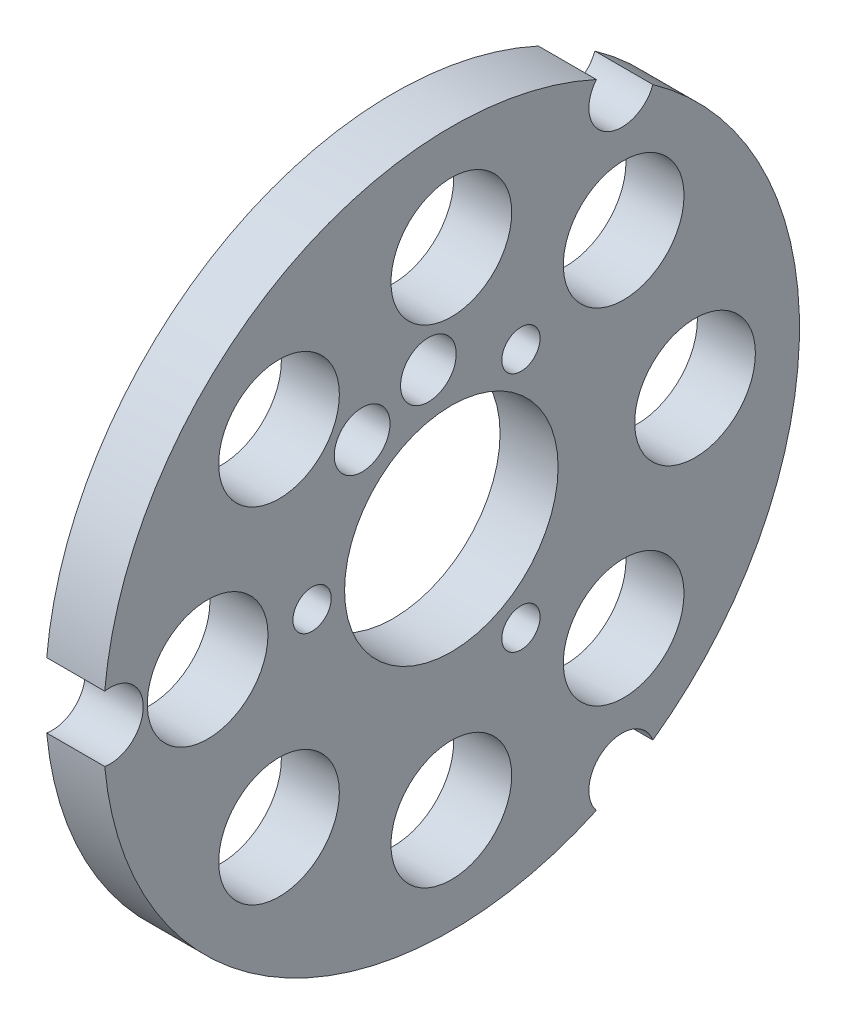
ISO-10303-21;
HEADER;
FILE_DESCRIPTION(('STEP AP214'),'2;1');
FILE_NAME('part.step','',(''),(''),'','','');
FILE_SCHEMA(('AUTOMOTIVE_DESIGN { 1 0 10303 214 1 1 1 1 }'));
ENDSEC;
DATA;
#1=APPLICATION_CONTEXT('core data for automotive mechanical design processes');
#2=APPLICATION_PROTOCOL_DEFINITION('international standard','automotive_design',2000,#1);
#3=PRODUCT_CONTEXT('',#1,'mechanical');
#4=PRODUCT('Part','Part','',(#3));
#5=PRODUCT_RELATED_PRODUCT_CATEGORY('part','',(#4));
#6=PRODUCT_DEFINITION_FORMATION('','',#4);
#7=PRODUCT_DEFINITION_CONTEXT('part definition',#1,'design');
#8=PRODUCT_DEFINITION('design','',#6,#7);
#9=PRODUCT_DEFINITION_SHAPE('','',#8);
#10=(LENGTH_UNIT() NAMED_UNIT(*) SI_UNIT(.MILLI.,.METRE.));
#11=(NAMED_UNIT(*) PLANE_ANGLE_UNIT() SI_UNIT($,.RADIAN.));
#12=(NAMED_UNIT(*) SI_UNIT($,.STERADIAN.) SOLID_ANGLE_UNIT());
#13=UNCERTAINTY_MEASURE_WITH_UNIT(LENGTH_MEASURE(1.E-05),#10,'distance_accuracy_value','');
#14=(GEOMETRIC_REPRESENTATION_CONTEXT(3) GLOBAL_UNCERTAINTY_ASSIGNED_CONTEXT((#13)) GLOBAL_UNIT_ASSIGNED_CONTEXT((#10,
#11,#12)) REPRESENTATION_CONTEXT('',''));
#15=CARTESIAN_POINT('',(0.,0.,0.));
#16=DIRECTION('',(0.,0.,1.));
#17=DIRECTION('',(1.,0.,0.));
#18=AXIS2_PLACEMENT_3D('',#15,#16,#17);
#19=CARTESIAN_POINT('',(-110.,0.,0.));
#20=DIRECTION('',(-1.,0.,0.));
#21=DIRECTION('',(0.,0.,1.));
#22=AXIS2_PLACEMENT_3D('',#19,#20,#21);
#23=CYLINDRICAL_SURFACE('',#22,30.);
#24=DIRECTION('',(-1.,0.,0.));
#25=VECTOR('',#24,1.);
#26=CARTESIAN_POINT('',(74.35,24.460776156178,-17.3686622926855));
#27=LINE('',#26,#25);
#28=CARTESIAN_POINT('',(148.7,24.460776156178,-17.3686622926855));
#29=VERTEX_POINT('',#28);
#30=CARTESIAN_POINT('',(143.7,24.460776156178,-17.3686622926855));
#31=VERTEX_POINT('',#30);
#32=EDGE_CURVE('E11',#29,#31,#27,.T.);
#33=ORIENTED_EDGE('',*,*,#32,.F.);
#34=CARTESIAN_POINT('',(148.7,0.,0.));
#35=DIRECTION('',(-1.,0.,0.));
#36=DIRECTION('',(0.,0.,1.));
#37=AXIS2_PLACEMENT_3D('',#34,#35,#36);
#38=CIRCLE('',#37,30.);
#39=CARTESIAN_POINT('',(148.7,-24.460776156178,-17.3686622926855));
#40=VERTEX_POINT('',#39);
#41=EDGE_CURVE('E111',#29,#40,#38,.T.);
#42=ORIENTED_EDGE('',*,*,#41,.T.);
#43=DIRECTION('',(-1.,0.,0.));
#44=VECTOR('',#43,1.);
#45=CARTESIAN_POINT('',(74.35,-24.460776156178,-17.3686622926855));
#46=LINE('',#45,#44);
#47=CARTESIAN_POINT('',(143.7,-24.460776156178,-17.3686622926855));
#48=VERTEX_POINT('',#47);
#49=EDGE_CURVE('E103',#48,#40,#46,.F.);
#50=ORIENTED_EDGE('',*,*,#49,.F.);
#51=CARTESIAN_POINT('',(143.7,0.,0.));
#52=DIRECTION('',(-1.,0.,0.));
#53=DIRECTION('',(0.,0.,1.));
#54=AXIS2_PLACEMENT_3D('',#51,#52,#53);
#55=CIRCLE('',#54,30.);
#56=EDGE_CURVE('E121',#31,#48,#55,.T.);
#57=ORIENTED_EDGE('',*,*,#56,.F.);
#58=EDGE_LOOP('',(#33,#42,#50,#57));
#59=FACE_BOUND('',#58,.T.);
#60=ADVANCED_FACE('F33',(#59),#23,.T.);
#61=DIRECTION('',(-1.,0.,0.));
#62=VECTOR('',#61,1.);
#63=CARTESIAN_POINT('',(74.35,27.2720908533075,-12.4993224011921));
#64=LINE('',#63,#62);
#65=CARTESIAN_POINT('',(143.7,27.2720908533075,-12.4993224011921));
#66=VERTEX_POINT('',#65);
#67=CARTESIAN_POINT('',(148.7,27.2720908533075,-12.4993224011921));
#68=VERTEX_POINT('',#67);
#69=EDGE_CURVE('E41',#66,#68,#64,.F.);
#70=ORIENTED_EDGE('',*,*,#69,.F.);
#71=CARTESIAN_POINT('',(143.7,2.81131469712949,29.8679846938776));
#72=VERTEX_POINT('',#71);
#73=EDGE_CURVE('E102',#72,#66,#55,.T.);
#74=ORIENTED_EDGE('',*,*,#73,.F.);
#75=DIRECTION('',(-1.,0.,0.));
#76=VECTOR('',#75,1.);
#77=CARTESIAN_POINT('',(74.35,2.8113146971295,29.8679846938776));
#78=LINE('',#77,#76);
#79=CARTESIAN_POINT('',(148.7,2.8113146971295,29.8679846938776));
#80=VERTEX_POINT('',#79);
#81=EDGE_CURVE('E86',#80,#72,#78,.T.);
#82=ORIENTED_EDGE('',*,*,#81,.F.);
#83=EDGE_CURVE('E100',#80,#68,#38,.T.);
#84=ORIENTED_EDGE('',*,*,#83,.T.);
#85=EDGE_LOOP('',(#70,#74,#82,#84));
#86=FACE_BOUND('',#85,.T.);
#87=ADVANCED_FACE('F99',(#86),#23,.T.);
#88=DIRECTION('',(-1.,0.,0.));
#89=VECTOR('',#88,1.);
#90=CARTESIAN_POINT('',(74.35,-27.2720908533075,-12.4993224011921));
#91=LINE('',#90,#89);
#92=CARTESIAN_POINT('',(148.7,-27.2720908533075,-12.4993224011921));
#93=VERTEX_POINT('',#92);
#94=CARTESIAN_POINT('',(143.7,-27.2720908533075,-12.4993224011921));
#95=VERTEX_POINT('',#94);
#96=EDGE_CURVE('E215',#93,#95,#91,.T.);
#97=ORIENTED_EDGE('',*,*,#96,.F.);
#98=CARTESIAN_POINT('',(148.7,-2.8113146971295,29.8679846938776));
#99=VERTEX_POINT('',#98);
#100=EDGE_CURVE('E113',#93,#99,#38,.T.);
#101=ORIENTED_EDGE('',*,*,#100,.T.);
#102=DIRECTION('',(-1.,0.,0.));
#103=VECTOR('',#102,1.);
#104=CARTESIAN_POINT('',(74.35,-2.8113146971295,29.8679846938776));
#105=LINE('',#104,#103);
#106=CARTESIAN_POINT('',(143.7,-2.81131469712952,29.8679846938775));
#107=VERTEX_POINT('',#106);
#108=EDGE_CURVE('E87',#107,#99,#105,.F.);
#109=ORIENTED_EDGE('',*,*,#108,.F.);
#110=EDGE_CURVE('E122',#95,#107,#55,.T.);
#111=ORIENTED_EDGE('',*,*,#110,.F.);
#112=EDGE_LOOP('',(#97,#101,#109,#111));
#113=FACE_BOUND('',#112,.T.);
#114=ADVANCED_FACE('F216',(#113),#23,.T.);
#115=CARTESIAN_POINT('',(143.7,30.,0.));
#116=DIRECTION('',(1.,0.,0.));
#117=DIRECTION('',(0.,0.,-1.));
#118=AXIS2_PLACEMENT_3D('',#115,#116,#117);
#119=PLANE('',#118);
#120=CARTESIAN_POINT('',(143.7,12.8487337040411,1.97738266469541));
#121=DIRECTION('',(1.,0.,0.));
#122=DIRECTION('',(0.,0.,-1.));
#123=AXIS2_PLACEMENT_3D('',#120,#121,#122);
#124=CIRCLE('',#123,2.4);
#125=CARTESIAN_POINT('',(143.7,12.8487337040411,-0.422617335304591));
#126=VERTEX_POINT('',#125);
#127=EDGE_CURVE('E128',#126,#126,#124,.F.);
#128=ORIENTED_EDGE('',*,*,#127,.F.);
#129=EDGE_LOOP('',(#128));
#130=FACE_BOUND('',#129,.T.);
#131=CARTESIAN_POINT('',(143.7,14.8492424049175,-14.8492424049175));
#132=DIRECTION('',(1.,0.,0.));
#133=DIRECTION('',(0.,0.,-1.));
#134=AXIS2_PLACEMENT_3D('',#131,#132,#133);
#135=CIRCLE('',#134,5.2);
#136=CARTESIAN_POINT('',(143.7,14.8492424049175,-20.0492424049175));
#137=VERTEX_POINT('',#136);
#138=EDGE_CURVE('E131',#137,#137,#135,.F.);
#139=ORIENTED_EDGE('',*,*,#138,.F.);
#140=EDGE_LOOP('',(#139));
#141=FACE_BOUND('',#140,.T.);
#142=CARTESIAN_POINT('',(143.7,0.,-21.));
#143=DIRECTION('',(1.,0.,0.));
#144=DIRECTION('',(0.,0.,-1.));
#145=AXIS2_PLACEMENT_3D('',#142,#143,#144);
#146=CIRCLE('',#145,5.2);
#147=CARTESIAN_POINT('',(143.7,0.,-26.2));
#148=VERTEX_POINT('',#147);
#149=EDGE_CURVE('E135',#148,#148,#146,.F.);
#150=ORIENTED_EDGE('',*,*,#149,.F.);
#151=EDGE_LOOP('',(#150));
#152=FACE_BOUND('',#151,.T.);
#153=CARTESIAN_POINT('',(143.7,-14.8492424049175,-14.8492424049175));
#154=DIRECTION('',(1.,0.,0.));
#155=DIRECTION('',(0.,0.,-1.));
#156=AXIS2_PLACEMENT_3D('',#153,#154,#155);
#157=CIRCLE('',#156,5.2);
#158=CARTESIAN_POINT('',(143.7,-14.8492424049175,-20.0492424049175));
#159=VERTEX_POINT('',#158);
#160=EDGE_CURVE('E140',#159,#159,#157,.F.);
#161=ORIENTED_EDGE('',*,*,#160,.F.);
#162=EDGE_LOOP('',(#161));
#163=FACE_BOUND('',#162,.T.);
#164=CARTESIAN_POINT('',(143.7,-21.,0.));
#165=DIRECTION('',(1.,0.,0.));
#166=DIRECTION('',(0.,0.,-1.));
#167=AXIS2_PLACEMENT_3D('',#164,#165,#166);
#168=CIRCLE('',#167,5.2);
#169=CARTESIAN_POINT('',(143.7,-21.,-5.2));
#170=VERTEX_POINT('',#169);
#171=EDGE_CURVE('E143',#170,#170,#168,.F.);
#172=ORIENTED_EDGE('',*,*,#171,.F.);
#173=EDGE_LOOP('',(#172));
#174=FACE_BOUND('',#173,.T.);
#175=CARTESIAN_POINT('',(143.7,-14.8492424049175,14.8492424049175));
#176=DIRECTION('',(1.,0.,0.));
#177=DIRECTION('',(0.,0.,-1.));
#178=AXIS2_PLACEMENT_3D('',#175,#176,#177);
#179=CIRCLE('',#178,5.2);
#180=CARTESIAN_POINT('',(143.7,-14.8492424049175,9.6492424049175));
#181=VERTEX_POINT('',#180);
#182=EDGE_CURVE('E146',#181,#181,#179,.F.);
#183=ORIENTED_EDGE('',*,*,#182,.F.);
#184=EDGE_LOOP('',(#183));
#185=FACE_BOUND('',#184,.T.);
#186=CARTESIAN_POINT('',(143.7,0.,21.));
#187=DIRECTION('',(1.,0.,0.));
#188=DIRECTION('',(0.,0.,-1.));
#189=AXIS2_PLACEMENT_3D('',#186,#187,#188);
#190=CIRCLE('',#189,5.2);
#191=CARTESIAN_POINT('',(143.7,0.,15.8));
#192=VERTEX_POINT('',#191);
#193=EDGE_CURVE('E149',#192,#192,#190,.F.);
#194=ORIENTED_EDGE('',*,*,#193,.F.);
#195=EDGE_LOOP('',(#194));
#196=FACE_BOUND('',#195,.T.);
#197=CARTESIAN_POINT('',(143.7,14.8492424049175,14.8492424049175));
#198=DIRECTION('',(1.,0.,0.));
#199=DIRECTION('',(0.,0.,-1.));
#200=AXIS2_PLACEMENT_3D('',#197,#198,#199);
#201=CIRCLE('',#200,5.2);
#202=CARTESIAN_POINT('',(143.7,14.8492424049175,9.6492424049175));
#203=VERTEX_POINT('',#202);
#204=EDGE_CURVE('E152',#203,#203,#201,.F.);
#205=ORIENTED_EDGE('',*,*,#204,.F.);
#206=EDGE_LOOP('',(#205));
#207=FACE_BOUND('',#206,.T.);
#208=CARTESIAN_POINT('',(143.7,25.4611468712625,-14.7));
#209=DIRECTION('',(1.,0.,0.));
#210=DIRECTION('',(0.,0.,-1.));
#211=AXIS2_PLACEMENT_3D('',#208,#209,#210);
#212=CIRCLE('',#211,2.85);
#213=EDGE_CURVE('E170',#31,#66,#212,.F.);
#214=ORIENTED_EDGE('',*,*,#213,.F.);
#215=ORIENTED_EDGE('',*,*,#56,.T.);
#216=CARTESIAN_POINT('',(143.7,-25.4611468712625,-14.7));
#217=DIRECTION('',(1.,0.,0.));
#218=DIRECTION('',(0.,0.,-1.));
#219=AXIS2_PLACEMENT_3D('',#216,#217,#218);
#220=CIRCLE('',#219,2.85);
#221=EDGE_CURVE('E56',#95,#48,#220,.F.);
#222=ORIENTED_EDGE('',*,*,#221,.F.);
#223=ORIENTED_EDGE('',*,*,#110,.T.);
#224=CARTESIAN_POINT('',(143.7,0.,29.4));
#225=DIRECTION('',(1.,0.,0.));
#226=DIRECTION('',(0.,0.,-1.));
#227=AXIS2_PLACEMENT_3D('',#224,#225,#226);
#228=CIRCLE('',#227,2.85);
#229=EDGE_CURVE('E48',#72,#107,#228,.F.);
#230=ORIENTED_EDGE('',*,*,#229,.F.);
#231=ORIENTED_EDGE('',*,*,#73,.T.);
#232=EDGE_LOOP('',(#214,#215,#222,#223,#230,#231));
#233=FACE_BOUND('',#232,.T.);
#234=CARTESIAN_POINT('',(143.7,10.3923048454133,-6.00000000000001));
#235=DIRECTION('',(1.,0.,0.));
#236=DIRECTION('',(0.,0.,-1.));
#237=AXIS2_PLACEMENT_3D('',#234,#235,#236);
#238=CIRCLE('',#237,1.65);
#239=CARTESIAN_POINT('',(143.7,10.3923048454133,-7.65000000000001));
#240=VERTEX_POINT('',#239);
#241=EDGE_CURVE('E155',#240,#240,#238,.F.);
#242=ORIENTED_EDGE('',*,*,#241,.F.);
#243=EDGE_LOOP('',(#242));
#244=FACE_BOUND('',#243,.T.);
#245=CARTESIAN_POINT('',(143.7,-10.3923048454133,-6.));
#246=DIRECTION('',(1.,0.,0.));
#247=DIRECTION('',(0.,0.,-1.));
#248=AXIS2_PLACEMENT_3D('',#245,#246,#247);
#249=CIRCLE('',#248,1.65);
#250=CARTESIAN_POINT('',(143.7,-10.3923048454133,-7.65));
#251=VERTEX_POINT('',#250);
#252=EDGE_CURVE('E158',#251,#251,#249,.F.);
#253=ORIENTED_EDGE('',*,*,#252,.F.);
#254=EDGE_LOOP('',(#253));
#255=FACE_BOUND('',#254,.T.);
#256=CARTESIAN_POINT('',(143.7,0.,12.));
#257=DIRECTION('',(1.,0.,0.));
#258=DIRECTION('',(0.,0.,-1.));
#259=AXIS2_PLACEMENT_3D('',#256,#257,#258);
#260=CIRCLE('',#259,1.65);
#261=CARTESIAN_POINT('',(143.7,0.,10.35));
#262=VERTEX_POINT('',#261);
#263=EDGE_CURVE('E161',#262,#262,#260,.F.);
#264=ORIENTED_EDGE('',*,*,#263,.F.);
#265=EDGE_LOOP('',(#264));
#266=FACE_BOUND('',#265,.T.);
#267=CARTESIAN_POINT('',(143.7,10.4836474229945,7.68720604058077));
#268=DIRECTION('',(1.,0.,0.));
#269=DIRECTION('',(0.,0.,-1.));
#270=AXIS2_PLACEMENT_3D('',#267,#268,#269);
#271=CIRCLE('',#270,2.4);
#272=CARTESIAN_POINT('',(143.7,10.4836474229945,5.28720604058077));
#273=VERTEX_POINT('',#272);
#274=EDGE_CURVE('E164',#273,#273,#271,.F.);
#275=ORIENTED_EDGE('',*,*,#274,.F.);
#276=EDGE_LOOP('',(#275));
#277=FACE_BOUND('',#276,.T.);
#278=CARTESIAN_POINT('',(143.7,21.,0.));
#279=DIRECTION('',(1.,0.,0.));
#280=DIRECTION('',(0.,0.,-1.));
#281=AXIS2_PLACEMENT_3D('',#278,#279,#280);
#282=CIRCLE('',#281,5.2);
#283=CARTESIAN_POINT('',(143.7,21.,-5.2));
#284=VERTEX_POINT('',#283);
#285=EDGE_CURVE('E167',#284,#284,#282,.F.);
#286=ORIENTED_EDGE('',*,*,#285,.F.);
#287=EDGE_LOOP('',(#286));
#288=FACE_BOUND('',#287,.T.);
#289=CARTESIAN_POINT('',(143.7,0.,0.));
#290=DIRECTION('',(-1.,0.,0.));
#291=DIRECTION('',(0.,0.,1.));
#292=AXIS2_PLACEMENT_3D('',#289,#290,#291);
#293=CIRCLE('',#292,9.2);
#294=CARTESIAN_POINT('',(143.7,0.,9.2));
#295=VERTEX_POINT('',#294);
#296=EDGE_CURVE('E115',#295,#295,#293,.T.);
#297=ORIENTED_EDGE('',*,*,#296,.F.);
#298=EDGE_LOOP('',(#297));
#299=FACE_BOUND('',#298,.T.);
#300=ADVANCED_FACE('F35',(#130,#141,#152,#163,#174,#185,#196,#207,#233,#244,#255,#266,#277,#288,
#299),#119,.F.);
#301=CARTESIAN_POINT('',(-110.,0.,0.));
#302=DIRECTION('',(-1.,0.,0.));
#303=DIRECTION('',(0.,0.,1.));
#304=AXIS2_PLACEMENT_3D('',#301,#302,#303);
#305=CYLINDRICAL_SURFACE('',#304,9.2);
#306=CARTESIAN_POINT('',(148.7,0.,0.));
#307=DIRECTION('',(-1.,0.,0.));
#308=DIRECTION('',(0.,0.,1.));
#309=AXIS2_PLACEMENT_3D('',#306,#307,#308);
#310=CIRCLE('',#309,9.2);
#311=CARTESIAN_POINT('',(148.7,0.,9.2));
#312=VERTEX_POINT('',#311);
#313=EDGE_CURVE('E110',#312,#312,#310,.T.);
#314=ORIENTED_EDGE('',*,*,#313,.F.);
#315=EDGE_LOOP('',(#314));
#316=FACE_BOUND('',#315,.T.);
#317=ORIENTED_EDGE('',*,*,#296,.T.);
#318=EDGE_LOOP('',(#317));
#319=FACE_BOUND('',#318,.T.);
#320=ADVANCED_FACE('F224',(#316,#319),#305,.F.);
#321=CARTESIAN_POINT('',(148.7,9.2,0.));
#322=DIRECTION('',(-1.,0.,0.));
#323=DIRECTION('',(0.,0.,1.));
#324=AXIS2_PLACEMENT_3D('',#321,#322,#323);
#325=PLANE('',#324);
#326=CARTESIAN_POINT('',(148.7,12.8487337040411,1.97738266469541));
#327=DIRECTION('',(1.,0.,0.));
#328=DIRECTION('',(0.,0.,-1.));
#329=AXIS2_PLACEMENT_3D('',#326,#327,#328);
#330=CIRCLE('',#329,2.4);
#331=CARTESIAN_POINT('',(148.7,12.8487337040411,-0.422617335304591));
#332=VERTEX_POINT('',#331);
#333=EDGE_CURVE('E190',#332,#332,#330,.T.);
#334=ORIENTED_EDGE('',*,*,#333,.F.);
#335=EDGE_LOOP('',(#334));
#336=FACE_BOUND('',#335,.T.);
#337=CARTESIAN_POINT('',(148.7,14.8492424049175,-14.8492424049175));
#338=DIRECTION('',(1.,0.,0.));
#339=DIRECTION('',(0.,0.,-1.));
#340=AXIS2_PLACEMENT_3D('',#337,#338,#339);
#341=CIRCLE('',#340,5.2);
#342=CARTESIAN_POINT('',(148.7,14.8492424049175,-20.0492424049175));
#343=VERTEX_POINT('',#342);
#344=EDGE_CURVE('E193',#343,#343,#341,.T.);
#345=ORIENTED_EDGE('',*,*,#344,.F.);
#346=EDGE_LOOP('',(#345));
#347=FACE_BOUND('',#346,.T.);
#348=CARTESIAN_POINT('',(148.7,0.,-21.));
#349=DIRECTION('',(1.,0.,0.));
#350=DIRECTION('',(0.,0.,-1.));
#351=AXIS2_PLACEMENT_3D('',#348,#349,#350);
#352=CIRCLE('',#351,5.2);
#353=CARTESIAN_POINT('',(148.7,0.,-26.2));
#354=VERTEX_POINT('',#353);
#355=EDGE_CURVE('E197',#354,#354,#352,.T.);
#356=ORIENTED_EDGE('',*,*,#355,.F.);
#357=EDGE_LOOP('',(#356));
#358=FACE_BOUND('',#357,.T.);
#359=CARTESIAN_POINT('',(148.7,-14.8492424049175,-14.8492424049175));
#360=DIRECTION('',(1.,0.,0.));
#361=DIRECTION('',(0.,0.,-1.));
#362=AXIS2_PLACEMENT_3D('',#359,#360,#361);
#363=CIRCLE('',#362,5.2);
#364=CARTESIAN_POINT('',(148.7,-14.8492424049175,-20.0492424049175));
#365=VERTEX_POINT('',#364);
#366=EDGE_CURVE('E182',#365,#365,#363,.T.);
#367=ORIENTED_EDGE('',*,*,#366,.F.);
#368=EDGE_LOOP('',(#367));
#369=FACE_BOUND('',#368,.T.);
#370=CARTESIAN_POINT('',(148.7,-21.,0.));
#371=DIRECTION('',(1.,0.,0.));
#372=DIRECTION('',(0.,0.,-1.));
#373=AXIS2_PLACEMENT_3D('',#370,#371,#372);
#374=CIRCLE('',#373,5.2);
#375=CARTESIAN_POINT('',(148.7,-21.,-5.2));
#376=VERTEX_POINT('',#375);
#377=EDGE_CURVE('E178',#376,#376,#374,.T.);
#378=ORIENTED_EDGE('',*,*,#377,.F.);
#379=EDGE_LOOP('',(#378));
#380=FACE_BOUND('',#379,.T.);
#381=CARTESIAN_POINT('',(148.7,-14.8492424049175,14.8492424049175));
#382=DIRECTION('',(1.,0.,0.));
#383=DIRECTION('',(0.,0.,-1.));
#384=AXIS2_PLACEMENT_3D('',#381,#382,#383);
#385=CIRCLE('',#384,5.2);
#386=CARTESIAN_POINT('',(148.7,-14.8492424049175,9.6492424049175));
#387=VERTEX_POINT('',#386);
#388=EDGE_CURVE('E181',#387,#387,#385,.T.);
#389=ORIENTED_EDGE('',*,*,#388,.F.);
#390=EDGE_LOOP('',(#389));
#391=FACE_BOUND('',#390,.T.);
#392=CARTESIAN_POINT('',(148.7,0.,21.));
#393=DIRECTION('',(1.,0.,0.));
#394=DIRECTION('',(0.,0.,-1.));
#395=AXIS2_PLACEMENT_3D('',#392,#393,#394);
#396=CIRCLE('',#395,5.2);
#397=CARTESIAN_POINT('',(148.7,0.,15.8));
#398=VERTEX_POINT('',#397);
#399=EDGE_CURVE('E185',#398,#398,#396,.T.);
#400=ORIENTED_EDGE('',*,*,#399,.F.);
#401=EDGE_LOOP('',(#400));
#402=FACE_BOUND('',#401,.T.);
#403=CARTESIAN_POINT('',(148.7,14.8492424049175,14.8492424049175));
#404=DIRECTION('',(1.,0.,0.));
#405=DIRECTION('',(0.,0.,-1.));
#406=AXIS2_PLACEMENT_3D('',#403,#404,#405);
#407=CIRCLE('',#406,5.2);
#408=CARTESIAN_POINT('',(148.7,14.8492424049175,9.6492424049175));
#409=VERTEX_POINT('',#408);
#410=EDGE_CURVE('E177',#409,#409,#407,.T.);
#411=ORIENTED_EDGE('',*,*,#410,.F.);
#412=EDGE_LOOP('',(#411));
#413=FACE_BOUND('',#412,.T.);
#414=CARTESIAN_POINT('',(148.7,25.4611468712625,-14.7));
#415=DIRECTION('',(1.,0.,0.));
#416=DIRECTION('',(0.,0.,-1.));
#417=AXIS2_PLACEMENT_3D('',#414,#415,#416);
#418=CIRCLE('',#417,2.85);
#419=EDGE_CURVE('E109',#68,#29,#418,.T.);
#420=ORIENTED_EDGE('',*,*,#419,.F.);
#421=ORIENTED_EDGE('',*,*,#83,.F.);
#422=CARTESIAN_POINT('',(148.7,0.,29.4));
#423=DIRECTION('',(1.,0.,0.));
#424=DIRECTION('',(0.,0.,-1.));
#425=AXIS2_PLACEMENT_3D('',#422,#423,#424);
#426=CIRCLE('',#425,2.85);
#427=EDGE_CURVE('E83',#99,#80,#426,.T.);
#428=ORIENTED_EDGE('',*,*,#427,.F.);
#429=ORIENTED_EDGE('',*,*,#100,.F.);
#430=CARTESIAN_POINT('',(148.7,-25.4611468712625,-14.7));
#431=DIRECTION('',(1.,0.,0.));
#432=DIRECTION('',(0.,0.,-1.));
#433=AXIS2_PLACEMENT_3D('',#430,#431,#432);
#434=CIRCLE('',#433,2.85);
#435=EDGE_CURVE('E93',#40,#93,#434,.T.);
#436=ORIENTED_EDGE('',*,*,#435,.F.);
#437=ORIENTED_EDGE('',*,*,#41,.F.);
#438=EDGE_LOOP('',(#420,#421,#428,#429,#436,#437));
#439=FACE_BOUND('',#438,.T.);
#440=CARTESIAN_POINT('',(148.7,10.3923048454133,-6.00000000000001));
#441=DIRECTION('',(1.,0.,0.));
#442=DIRECTION('',(0.,0.,-1.));
#443=AXIS2_PLACEMENT_3D('',#440,#441,#442);
#444=CIRCLE('',#443,1.65);
#445=CARTESIAN_POINT('',(148.7,10.3923048454133,-7.65000000000001));
#446=VERTEX_POINT('',#445);
#447=EDGE_CURVE('E92',#446,#446,#444,.T.);
#448=ORIENTED_EDGE('',*,*,#447,.F.);
#449=EDGE_LOOP('',(#448));
#450=FACE_BOUND('',#449,.T.);
#451=CARTESIAN_POINT('',(148.7,-10.3923048454133,-6.));
#452=DIRECTION('',(1.,0.,0.));
#453=DIRECTION('',(0.,0.,-1.));
#454=AXIS2_PLACEMENT_3D('',#451,#452,#453);
#455=CIRCLE('',#454,1.65);
#456=CARTESIAN_POINT('',(148.7,-10.3923048454133,-7.65));
#457=VERTEX_POINT('',#456);
#458=EDGE_CURVE('E204',#457,#457,#455,.T.);
#459=ORIENTED_EDGE('',*,*,#458,.F.);
#460=EDGE_LOOP('',(#459));
#461=FACE_BOUND('',#460,.T.);
#462=CARTESIAN_POINT('',(148.7,0.,12.));
#463=DIRECTION('',(1.,0.,0.));
#464=DIRECTION('',(0.,0.,-1.));
#465=AXIS2_PLACEMENT_3D('',#462,#463,#464);
#466=CIRCLE('',#465,1.65);
#467=CARTESIAN_POINT('',(148.7,0.,10.35));
#468=VERTEX_POINT('',#467);
#469=EDGE_CURVE('E207',#468,#468,#466,.T.);
#470=ORIENTED_EDGE('',*,*,#469,.F.);
#471=EDGE_LOOP('',(#470));
#472=FACE_BOUND('',#471,.T.);
#473=CARTESIAN_POINT('',(148.7,10.4836474229945,7.68720604058077));
#474=DIRECTION('',(1.,0.,0.));
#475=DIRECTION('',(0.,0.,-1.));
#476=AXIS2_PLACEMENT_3D('',#473,#474,#475);
#477=CIRCLE('',#476,2.4);
#478=CARTESIAN_POINT('',(148.7,10.4836474229945,5.28720604058077));
#479=VERTEX_POINT('',#478);
#480=EDGE_CURVE('E194',#479,#479,#477,.T.);
#481=ORIENTED_EDGE('',*,*,#480,.F.);
#482=EDGE_LOOP('',(#481));
#483=FACE_BOUND('',#482,.T.);
#484=CARTESIAN_POINT('',(148.7,21.,0.));
#485=DIRECTION('',(1.,0.,0.));
#486=DIRECTION('',(0.,0.,-1.));
#487=AXIS2_PLACEMENT_3D('',#484,#485,#486);
#488=CIRCLE('',#487,5.2);
#489=CARTESIAN_POINT('',(148.7,21.,-5.2));
#490=VERTEX_POINT('',#489);
#491=EDGE_CURVE('E174',#490,#490,#488,.T.);
#492=ORIENTED_EDGE('',*,*,#491,.F.);
#493=EDGE_LOOP('',(#492));
#494=FACE_BOUND('',#493,.T.);
#495=ORIENTED_EDGE('',*,*,#313,.T.);
#496=EDGE_LOOP('',(#495));
#497=FACE_BOUND('',#496,.T.);
#498=ADVANCED_FACE('F106',(#336,#347,#358,#369,#380,#391,#402,#413,#439,#450,#461,#472,#483,
#494,#497),#325,.F.);
#499=CARTESIAN_POINT('',(148.7,0.,29.4));
#500=DIRECTION('',(-1.,0.,0.));
#501=DIRECTION('',(0.,0.,1.));
#502=AXIS2_PLACEMENT_3D('',#499,#500,#501);
#503=CYLINDRICAL_SURFACE('',#502,2.85);
#504=ORIENTED_EDGE('',*,*,#81,.T.);
#505=ORIENTED_EDGE('',*,*,#229,.T.);
#506=ORIENTED_EDGE('',*,*,#108,.T.);
#507=ORIENTED_EDGE('',*,*,#427,.T.);
#508=EDGE_LOOP('',(#504,#505,#506,#507));
#509=FACE_BOUND('',#508,.T.);
#510=ADVANCED_FACE('F85',(#509),#503,.F.);
#511=CARTESIAN_POINT('',(148.7,-25.4611468712625,-14.7));
#512=DIRECTION('',(-1.,0.,0.));
#513=DIRECTION('',(0.,0.,1.));
#514=AXIS2_PLACEMENT_3D('',#511,#512,#513);
#515=CYLINDRICAL_SURFACE('',#514,2.85);
#516=ORIENTED_EDGE('',*,*,#96,.T.);
#517=ORIENTED_EDGE('',*,*,#221,.T.);
#518=ORIENTED_EDGE('',*,*,#49,.T.);
#519=ORIENTED_EDGE('',*,*,#435,.T.);
#520=EDGE_LOOP('',(#516,#517,#518,#519));
#521=FACE_BOUND('',#520,.T.);
#522=ADVANCED_FACE('F214',(#521),#515,.F.);
#523=CARTESIAN_POINT('',(148.7,25.4611468712625,-14.7));
#524=DIRECTION('',(-1.,0.,0.));
#525=DIRECTION('',(0.,0.,1.));
#526=AXIS2_PLACEMENT_3D('',#523,#524,#525);
#527=CYLINDRICAL_SURFACE('',#526,2.85);
#528=ORIENTED_EDGE('',*,*,#32,.T.);
#529=ORIENTED_EDGE('',*,*,#213,.T.);
#530=ORIENTED_EDGE('',*,*,#69,.T.);
#531=ORIENTED_EDGE('',*,*,#419,.T.);
#532=EDGE_LOOP('',(#528,#529,#530,#531));
#533=FACE_BOUND('',#532,.T.);
#534=ADVANCED_FACE('F289',(#533),#527,.F.);
#535=CARTESIAN_POINT('',(148.7,21.,0.));
#536=DIRECTION('',(-1.,0.,0.));
#537=DIRECTION('',(0.,0.,1.));
#538=AXIS2_PLACEMENT_3D('',#535,#536,#537);
#539=CYLINDRICAL_SURFACE('',#538,5.2);
#540=ORIENTED_EDGE('',*,*,#491,.T.);
#541=EDGE_LOOP('',(#540));
#542=FACE_BOUND('',#541,.T.);
#543=ORIENTED_EDGE('',*,*,#285,.T.);
#544=EDGE_LOOP('',(#543));
#545=FACE_BOUND('',#544,.T.);
#546=ADVANCED_FACE('F243',(#542,#545),#539,.F.);
#547=CARTESIAN_POINT('',(148.7,10.4836474229945,7.68720604058077));
#548=DIRECTION('',(-1.,0.,0.));
#549=DIRECTION('',(0.,0.,1.));
#550=AXIS2_PLACEMENT_3D('',#547,#548,#549);
#551=CYLINDRICAL_SURFACE('',#550,2.4);
#552=ORIENTED_EDGE('',*,*,#480,.T.);
#553=EDGE_LOOP('',(#552));
#554=FACE_BOUND('',#553,.T.);
#555=ORIENTED_EDGE('',*,*,#274,.T.);
#556=EDGE_LOOP('',(#555));
#557=FACE_BOUND('',#556,.T.);
#558=ADVANCED_FACE('F288',(#554,#557),#551,.F.);
#559=CARTESIAN_POINT('',(148.7,0.,12.));
#560=DIRECTION('',(-1.,0.,0.));
#561=DIRECTION('',(0.,0.,1.));
#562=AXIS2_PLACEMENT_3D('',#559,#560,#561);
#563=CYLINDRICAL_SURFACE('',#562,1.65);
#564=ORIENTED_EDGE('',*,*,#469,.T.);
#565=EDGE_LOOP('',(#564));
#566=FACE_BOUND('',#565,.T.);
#567=ORIENTED_EDGE('',*,*,#263,.T.);
#568=EDGE_LOOP('',(#567));
#569=FACE_BOUND('',#568,.T.);
#570=ADVANCED_FACE('F295',(#566,#569),#563,.F.);
#571=CARTESIAN_POINT('',(148.7,-10.3923048454133,-6.));
#572=DIRECTION('',(-1.,0.,0.));
#573=DIRECTION('',(0.,0.,1.));
#574=AXIS2_PLACEMENT_3D('',#571,#572,#573);
#575=CYLINDRICAL_SURFACE('',#574,1.65);
#576=ORIENTED_EDGE('',*,*,#458,.T.);
#577=EDGE_LOOP('',(#576));
#578=FACE_BOUND('',#577,.T.);
#579=ORIENTED_EDGE('',*,*,#252,.T.);
#580=EDGE_LOOP('',(#579));
#581=FACE_BOUND('',#580,.T.);
#582=ADVANCED_FACE('F311',(#578,#581),#575,.F.);
#583=CARTESIAN_POINT('',(148.7,10.3923048454133,-6.00000000000001));
#584=DIRECTION('',(-1.,0.,0.));
#585=DIRECTION('',(0.,0.,1.));
#586=AXIS2_PLACEMENT_3D('',#583,#584,#585);
#587=CYLINDRICAL_SURFACE('',#586,1.65);
#588=ORIENTED_EDGE('',*,*,#447,.T.);
#589=EDGE_LOOP('',(#588));
#590=FACE_BOUND('',#589,.T.);
#591=ORIENTED_EDGE('',*,*,#241,.T.);
#592=EDGE_LOOP('',(#591));
#593=FACE_BOUND('',#592,.T.);
#594=ADVANCED_FACE('F271',(#590,#593),#587,.F.);
#595=CARTESIAN_POINT('',(148.7,14.8492424049175,14.8492424049175));
#596=DIRECTION('',(-1.,0.,0.));
#597=DIRECTION('',(0.,0.,1.));
#598=AXIS2_PLACEMENT_3D('',#595,#596,#597);
#599=CYLINDRICAL_SURFACE('',#598,5.2);
#600=ORIENTED_EDGE('',*,*,#410,.T.);
#601=EDGE_LOOP('',(#600));
#602=FACE_BOUND('',#601,.T.);
#603=ORIENTED_EDGE('',*,*,#204,.T.);
#604=EDGE_LOOP('',(#603));
#605=FACE_BOUND('',#604,.T.);
#606=ADVANCED_FACE('F267',(#602,#605),#599,.F.);
#607=CARTESIAN_POINT('',(148.7,0.,21.));
#608=DIRECTION('',(-1.,0.,0.));
#609=DIRECTION('',(0.,0.,1.));
#610=AXIS2_PLACEMENT_3D('',#607,#608,#609);
#611=CYLINDRICAL_SURFACE('',#610,5.2);
#612=ORIENTED_EDGE('',*,*,#399,.T.);
#613=EDGE_LOOP('',(#612));
#614=FACE_BOUND('',#613,.T.);
#615=ORIENTED_EDGE('',*,*,#193,.T.);
#616=EDGE_LOOP('',(#615));
#617=FACE_BOUND('',#616,.T.);
#618=ADVANCED_FACE('F270',(#614,#617),#611,.F.);
#619=CARTESIAN_POINT('',(148.7,-14.8492424049175,14.8492424049175));
#620=DIRECTION('',(-1.,0.,0.));
#621=DIRECTION('',(0.,0.,1.));
#622=AXIS2_PLACEMENT_3D('',#619,#620,#621);
#623=CYLINDRICAL_SURFACE('',#622,5.2);
#624=ORIENTED_EDGE('',*,*,#388,.T.);
#625=EDGE_LOOP('',(#624));
#626=FACE_BOUND('',#625,.T.);
#627=ORIENTED_EDGE('',*,*,#182,.T.);
#628=EDGE_LOOP('',(#627));
#629=FACE_BOUND('',#628,.T.);
#630=ADVANCED_FACE('F338',(#626,#629),#623,.F.);
#631=CARTESIAN_POINT('',(148.7,-21.,0.));
#632=DIRECTION('',(-1.,0.,0.));
#633=DIRECTION('',(0.,0.,1.));
#634=AXIS2_PLACEMENT_3D('',#631,#632,#633);
#635=CYLINDRICAL_SURFACE('',#634,5.2);
#636=ORIENTED_EDGE('',*,*,#377,.T.);
#637=EDGE_LOOP('',(#636));
#638=FACE_BOUND('',#637,.T.);
#639=ORIENTED_EDGE('',*,*,#171,.T.);
#640=EDGE_LOOP('',(#639));
#641=FACE_BOUND('',#640,.T.);
#642=ADVANCED_FACE('F323',(#638,#641),#635,.F.);
#643=CARTESIAN_POINT('',(148.7,-14.8492424049175,-14.8492424049175));
#644=DIRECTION('',(-1.,0.,0.));
#645=DIRECTION('',(0.,0.,1.));
#646=AXIS2_PLACEMENT_3D('',#643,#644,#645);
#647=CYLINDRICAL_SURFACE('',#646,5.2);
#648=ORIENTED_EDGE('',*,*,#366,.T.);
#649=EDGE_LOOP('',(#648));
#650=FACE_BOUND('',#649,.T.);
#651=ORIENTED_EDGE('',*,*,#160,.T.);
#652=EDGE_LOOP('',(#651));
#653=FACE_BOUND('',#652,.T.);
#654=ADVANCED_FACE('F319',(#650,#653),#647,.F.);
#655=CARTESIAN_POINT('',(148.7,0.,-21.));
#656=DIRECTION('',(-1.,0.,0.));
#657=DIRECTION('',(0.,0.,1.));
#658=AXIS2_PLACEMENT_3D('',#655,#656,#657);
#659=CYLINDRICAL_SURFACE('',#658,5.2);
#660=ORIENTED_EDGE('',*,*,#355,.T.);
#661=EDGE_LOOP('',(#660));
#662=FACE_BOUND('',#661,.T.);
#663=ORIENTED_EDGE('',*,*,#149,.T.);
#664=EDGE_LOOP('',(#663));
#665=FACE_BOUND('',#664,.T.);
#666=ADVANCED_FACE('F322',(#662,#665),#659,.F.);
#667=CARTESIAN_POINT('',(148.7,14.8492424049175,-14.8492424049175));
#668=DIRECTION('',(-1.,0.,0.));
#669=DIRECTION('',(0.,0.,1.));
#670=AXIS2_PLACEMENT_3D('',#667,#668,#669);
#671=CYLINDRICAL_SURFACE('',#670,5.2);
#672=ORIENTED_EDGE('',*,*,#344,.T.);
#673=EDGE_LOOP('',(#672));
#674=FACE_BOUND('',#673,.T.);
#675=ORIENTED_EDGE('',*,*,#138,.T.);
#676=EDGE_LOOP('',(#675));
#677=FACE_BOUND('',#676,.T.);
#678=ADVANCED_FACE('F327',(#674,#677),#671,.F.);
#679=CARTESIAN_POINT('',(148.7,12.8487337040411,1.97738266469541));
#680=DIRECTION('',(-1.,0.,0.));
#681=DIRECTION('',(0.,0.,1.));
#682=AXIS2_PLACEMENT_3D('',#679,#680,#681);
#683=CYLINDRICAL_SURFACE('',#682,2.4);
#684=ORIENTED_EDGE('',*,*,#333,.T.);
#685=EDGE_LOOP('',(#684));
#686=FACE_BOUND('',#685,.T.);
#687=ORIENTED_EDGE('',*,*,#127,.T.);
#688=EDGE_LOOP('',(#687));
#689=FACE_BOUND('',#688,.T.);
#690=ADVANCED_FACE('F331',(#686,#689),#683,.F.);
#691=CLOSED_SHELL('',(#60,#87,#114,#300,#320,#498,#510,#522,#534,#546,#558,#570,#582,#594,#606,
#618,#630,#642,#654,#666,#678,#690));
#692=MANIFOLD_SOLID_BREP('B2',#691);
#693=ADVANCED_BREP_SHAPE_REPRESENTATION('',(#18,#692),#14);
#694=SHAPE_DEFINITION_REPRESENTATION(#9,#693);
ENDSEC;
END-ISO-10303-21;
